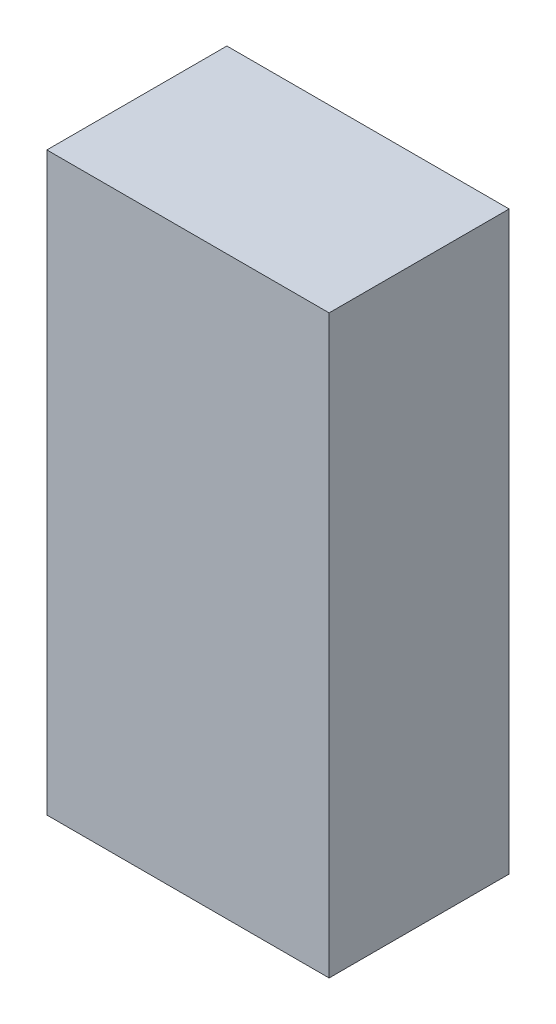
ISO-10303-21;
HEADER;
FILE_DESCRIPTION(('STEP AP214'),'2;1');
FILE_NAME('part.step','',(''),(''),'','','');
FILE_SCHEMA(('AUTOMOTIVE_DESIGN { 1 0 10303 214 1 1 1 1 }'));
ENDSEC;
DATA;
#1=APPLICATION_CONTEXT('core data for automotive mechanical design processes');
#2=APPLICATION_PROTOCOL_DEFINITION('international standard','automotive_design',2000,#1);
#3=PRODUCT_CONTEXT('',#1,'mechanical');
#4=PRODUCT('Part','Part','',(#3));
#5=PRODUCT_RELATED_PRODUCT_CATEGORY('part','',(#4));
#6=PRODUCT_DEFINITION_FORMATION('','',#4);
#7=PRODUCT_DEFINITION_CONTEXT('part definition',#1,'design');
#8=PRODUCT_DEFINITION('design','',#6,#7);
#9=PRODUCT_DEFINITION_SHAPE('','',#8);
#10=(LENGTH_UNIT() NAMED_UNIT(*) SI_UNIT(.MILLI.,.METRE.));
#11=(NAMED_UNIT(*) PLANE_ANGLE_UNIT() SI_UNIT($,.RADIAN.));
#12=(NAMED_UNIT(*) SI_UNIT($,.STERADIAN.) SOLID_ANGLE_UNIT());
#13=UNCERTAINTY_MEASURE_WITH_UNIT(LENGTH_MEASURE(1.E-05),#10,'distance_accuracy_value','');
#14=(GEOMETRIC_REPRESENTATION_CONTEXT(3) GLOBAL_UNCERTAINTY_ASSIGNED_CONTEXT((#13)) GLOBAL_UNIT_ASSIGNED_CONTEXT((#10,
#11,#12)) REPRESENTATION_CONTEXT('',''));
#15=CARTESIAN_POINT('',(0.,0.,0.));
#16=DIRECTION('',(0.,0.,1.));
#17=DIRECTION('',(1.,0.,0.));
#18=AXIS2_PLACEMENT_3D('',#15,#16,#17);
#19=CARTESIAN_POINT('',(6.223,12.7,7.9375));
#20=DIRECTION('',(-1.,0.,0.));
#21=DIRECTION('',(0.,-1.,0.));
#22=AXIS2_PLACEMENT_3D('',#19,#20,#21);
#23=PLANE('',#22);
#24=DIRECTION('',(0.,1.,0.));
#25=VECTOR('',#24,1.);
#26=CARTESIAN_POINT('',(6.223,12.7,0.));
#27=LINE('',#26,#25);
#28=CARTESIAN_POINT('',(6.223,-12.7,0.));
#29=VERTEX_POINT('',#28);
#30=CARTESIAN_POINT('',(6.223,12.7,0.));
#31=VERTEX_POINT('',#30);
#32=EDGE_CURVE('E107',#29,#31,#27,.T.);
#33=ORIENTED_EDGE('',*,*,#32,.T.);
#34=DIRECTION('',(0.,0.,-1.));
#35=VECTOR('',#34,1.);
#36=CARTESIAN_POINT('',(6.223,12.7,7.9375));
#37=LINE('',#36,#35);
#38=CARTESIAN_POINT('',(6.223,12.7,7.9375));
#39=VERTEX_POINT('',#38);
#40=EDGE_CURVE('E11',#39,#31,#37,.T.);
#41=ORIENTED_EDGE('',*,*,#40,.F.);
#42=DIRECTION('',(0.,1.,0.));
#43=VECTOR('',#42,1.);
#44=CARTESIAN_POINT('',(6.223,12.7,7.9375));
#45=LINE('',#44,#43);
#46=CARTESIAN_POINT('',(6.223,-12.7,7.9375));
#47=VERTEX_POINT('',#46);
#48=EDGE_CURVE('E91',#47,#39,#45,.T.);
#49=ORIENTED_EDGE('',*,*,#48,.F.);
#50=DIRECTION('',(0.,0.,-1.));
#51=VECTOR('',#50,1.);
#52=CARTESIAN_POINT('',(6.223,-12.7,7.9375));
#53=LINE('',#52,#51);
#54=EDGE_CURVE('E103',#47,#29,#53,.T.);
#55=ORIENTED_EDGE('',*,*,#54,.T.);
#56=EDGE_LOOP('',(#33,#41,#49,#55));
#57=FACE_BOUND('',#56,.T.);
#58=ADVANCED_FACE('F39',(#57),#23,.F.);
#59=CARTESIAN_POINT('',(-6.223,12.7,7.9375));
#60=DIRECTION('',(0.,-1.,0.));
#61=DIRECTION('',(0.,0.,-1.));
#62=AXIS2_PLACEMENT_3D('',#59,#60,#61);
#63=PLANE('',#62);
#64=DIRECTION('',(-1.,0.,0.));
#65=VECTOR('',#64,1.);
#66=CARTESIAN_POINT('',(-6.223,12.7,0.));
#67=LINE('',#66,#65);
#68=CARTESIAN_POINT('',(-6.223,12.7,0.));
#69=VERTEX_POINT('',#68);
#70=EDGE_CURVE('E96',#31,#69,#67,.T.);
#71=ORIENTED_EDGE('',*,*,#70,.T.);
#72=DIRECTION('',(0.,0.,-1.));
#73=VECTOR('',#72,1.);
#74=CARTESIAN_POINT('',(-6.223,12.7,7.9375));
#75=LINE('',#74,#73);
#76=CARTESIAN_POINT('',(-6.223,12.7,7.9375));
#77=VERTEX_POINT('',#76);
#78=EDGE_CURVE('E48',#77,#69,#75,.T.);
#79=ORIENTED_EDGE('',*,*,#78,.F.);
#80=DIRECTION('',(-1.,0.,0.));
#81=VECTOR('',#80,1.);
#82=CARTESIAN_POINT('',(-6.223,12.7,7.9375));
#83=LINE('',#82,#81);
#84=EDGE_CURVE('E86',#39,#77,#83,.T.);
#85=ORIENTED_EDGE('',*,*,#84,.F.);
#86=ORIENTED_EDGE('',*,*,#40,.T.);
#87=EDGE_LOOP('',(#71,#79,#85,#86));
#88=FACE_BOUND('',#87,.T.);
#89=ADVANCED_FACE('F95',(#88),#63,.F.);
#90=CARTESIAN_POINT('',(-6.223,12.7,7.9375));
#91=DIRECTION('',(1.,0.,0.));
#92=DIRECTION('',(0.,1.,0.));
#93=AXIS2_PLACEMENT_3D('',#90,#91,#92);
#94=PLANE('',#93);
#95=DIRECTION('',(0.,-1.,0.));
#96=VECTOR('',#95,1.);
#97=CARTESIAN_POINT('',(-6.223,12.7,0.));
#98=LINE('',#97,#96);
#99=CARTESIAN_POINT('',(-6.223,-12.7,0.));
#100=VERTEX_POINT('',#99);
#101=EDGE_CURVE('E73',#69,#100,#98,.T.);
#102=ORIENTED_EDGE('',*,*,#101,.T.);
#103=DIRECTION('',(0.,0.,-1.));
#104=VECTOR('',#103,1.);
#105=CARTESIAN_POINT('',(-6.223,-12.7,7.9375));
#106=LINE('',#105,#104);
#107=CARTESIAN_POINT('',(-6.223,-12.7,7.9375));
#108=VERTEX_POINT('',#107);
#109=EDGE_CURVE('E98',#108,#100,#106,.T.);
#110=ORIENTED_EDGE('',*,*,#109,.F.);
#111=DIRECTION('',(0.,-1.,0.));
#112=VECTOR('',#111,1.);
#113=CARTESIAN_POINT('',(-6.223,12.7,7.9375));
#114=LINE('',#113,#112);
#115=EDGE_CURVE('E89',#77,#108,#114,.T.);
#116=ORIENTED_EDGE('',*,*,#115,.F.);
#117=ORIENTED_EDGE('',*,*,#78,.T.);
#118=EDGE_LOOP('',(#102,#110,#116,#117));
#119=FACE_BOUND('',#118,.T.);
#120=ADVANCED_FACE('F99',(#119),#94,.F.);
#121=CARTESIAN_POINT('',(-6.223,-12.7,7.9375));
#122=DIRECTION('',(0.,1.,0.));
#123=DIRECTION('',(0.,0.,1.));
#124=AXIS2_PLACEMENT_3D('',#121,#122,#123);
#125=PLANE('',#124);
#126=DIRECTION('',(1.,0.,0.));
#127=VECTOR('',#126,1.);
#128=CARTESIAN_POINT('',(-6.223,-12.7,0.));
#129=LINE('',#128,#127);
#130=EDGE_CURVE('E79',#100,#29,#129,.T.);
#131=ORIENTED_EDGE('',*,*,#130,.T.);
#132=ORIENTED_EDGE('',*,*,#54,.F.);
#133=DIRECTION('',(1.,0.,0.));
#134=VECTOR('',#133,1.);
#135=CARTESIAN_POINT('',(-6.223,-12.7,7.9375));
#136=LINE('',#135,#134);
#137=EDGE_CURVE('E56',#108,#47,#136,.T.);
#138=ORIENTED_EDGE('',*,*,#137,.F.);
#139=ORIENTED_EDGE('',*,*,#109,.T.);
#140=EDGE_LOOP('',(#131,#132,#138,#139));
#141=FACE_BOUND('',#140,.T.);
#142=ADVANCED_FACE('F120',(#141),#125,.F.);
#143=CARTESIAN_POINT('',(0.,0.,7.9375));
#144=DIRECTION('',(0.,0.,1.));
#145=DIRECTION('',(1.,0.,0.));
#146=AXIS2_PLACEMENT_3D('',#143,#144,#145);
#147=PLANE('',#146);
#148=ORIENTED_EDGE('',*,*,#48,.T.);
#149=ORIENTED_EDGE('',*,*,#84,.T.);
#150=ORIENTED_EDGE('',*,*,#115,.T.);
#151=ORIENTED_EDGE('',*,*,#137,.T.);
#152=EDGE_LOOP('',(#148,#149,#150,#151));
#153=FACE_BOUND('',#152,.T.);
#154=ADVANCED_FACE('F87',(#153),#147,.T.);
#155=CARTESIAN_POINT('',(0.,0.,0.));
#156=DIRECTION('',(0.,0.,1.));
#157=DIRECTION('',(1.,0.,0.));
#158=AXIS2_PLACEMENT_3D('',#155,#156,#157);
#159=PLANE('',#158);
#160=ORIENTED_EDGE('',*,*,#32,.F.);
#161=ORIENTED_EDGE('',*,*,#130,.F.);
#162=ORIENTED_EDGE('',*,*,#101,.F.);
#163=ORIENTED_EDGE('',*,*,#70,.F.);
#164=EDGE_LOOP('',(#160,#161,#162,#163));
#165=FACE_BOUND('',#164,.T.);
#166=ADVANCED_FACE('F123',(#165),#159,.F.);
#167=CLOSED_SHELL('',(#58,#89,#120,#142,#154,#166));
#168=MANIFOLD_SOLID_BREP('B2',#167);
#169=ADVANCED_BREP_SHAPE_REPRESENTATION('',(#18,#168),#14);
#170=SHAPE_DEFINITION_REPRESENTATION(#9,#169);
ENDSEC;
END-ISO-10303-21;
